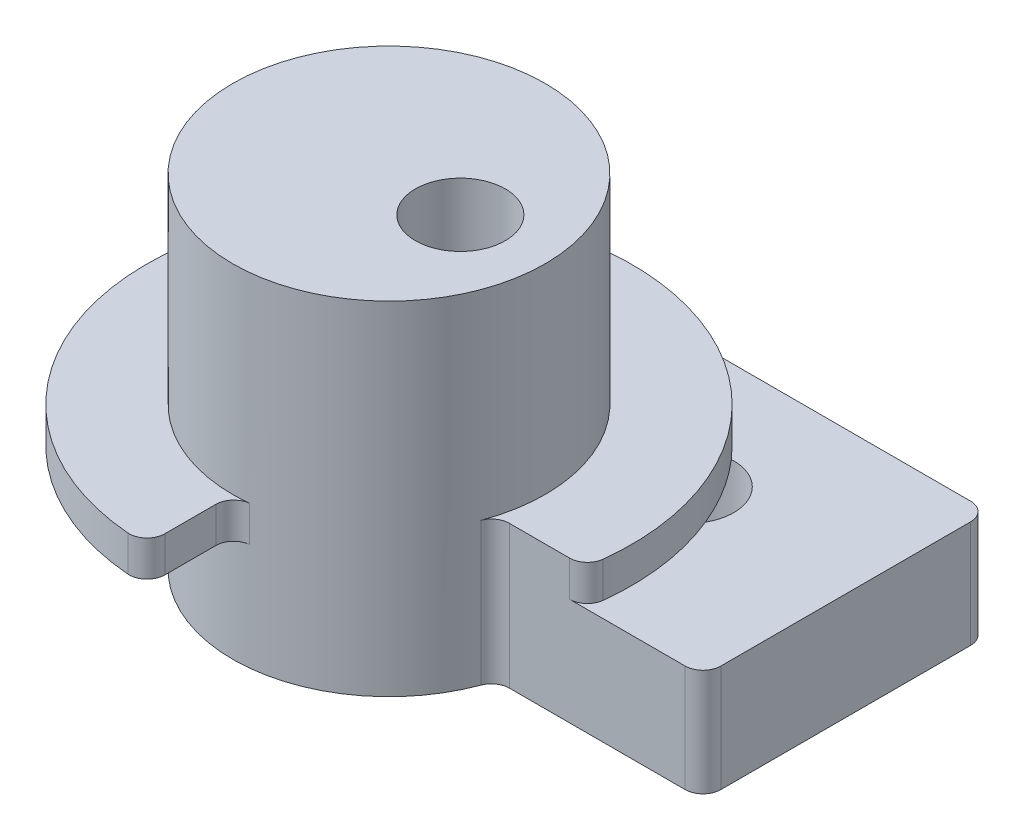
ISO-10303-21;
HEADER;
FILE_DESCRIPTION(('STEP AP214'),'2;1');
FILE_NAME('part.step','',(''),(''),'','','');
FILE_SCHEMA(('AUTOMOTIVE_DESIGN { 1 0 10303 214 1 1 1 1 }'));
ENDSEC;
DATA;
#1=APPLICATION_CONTEXT('core data for automotive mechanical design processes');
#2=APPLICATION_PROTOCOL_DEFINITION('international standard','automotive_design',2000,#1);
#3=PRODUCT_CONTEXT('',#1,'mechanical');
#4=PRODUCT('Part','Part','',(#3));
#5=PRODUCT_RELATED_PRODUCT_CATEGORY('part','',(#4));
#6=PRODUCT_DEFINITION_FORMATION('','',#4);
#7=PRODUCT_DEFINITION_CONTEXT('part definition',#1,'design');
#8=PRODUCT_DEFINITION('design','',#6,#7);
#9=PRODUCT_DEFINITION_SHAPE('','',#8);
#10=(LENGTH_UNIT() NAMED_UNIT(*) SI_UNIT(.MILLI.,.METRE.));
#11=(NAMED_UNIT(*) PLANE_ANGLE_UNIT() SI_UNIT($,.RADIAN.));
#12=(NAMED_UNIT(*) SI_UNIT($,.STERADIAN.) SOLID_ANGLE_UNIT());
#13=UNCERTAINTY_MEASURE_WITH_UNIT(LENGTH_MEASURE(1.E-05),#10,'distance_accuracy_value','');
#14=(GEOMETRIC_REPRESENTATION_CONTEXT(3) GLOBAL_UNCERTAINTY_ASSIGNED_CONTEXT((#13)) GLOBAL_UNIT_ASSIGNED_CONTEXT((#10,
#11,#12)) REPRESENTATION_CONTEXT('',''));
#15=CARTESIAN_POINT('',(0.,0.,0.));
#16=DIRECTION('',(0.,0.,1.));
#17=DIRECTION('',(1.,0.,0.));
#18=AXIS2_PLACEMENT_3D('',#15,#16,#17);
#19=CARTESIAN_POINT('',(0.,-10.4775,0.));
#20=DIRECTION('',(0.,-1.,0.));
#21=DIRECTION('',(-1.,0.,0.));
#22=AXIS2_PLACEMENT_3D('',#19,#20,#21);
#23=PLANE('',#22);
#24=CARTESIAN_POINT('',(0.,-10.4775,0.));
#25=DIRECTION('',(0.,-1.,0.));
#26=DIRECTION('',(1.,0.,0.));
#27=AXIS2_PLACEMENT_3D('',#24,#25,#26);
#28=CIRCLE('',#27,10.795);
#29=CARTESIAN_POINT('',(8.15130115952804,-10.4775,-7.07730982836534));
#30=VERTEX_POINT('',#29);
#31=CARTESIAN_POINT('',(9.99127496158985,-10.4775,-4.08735240001491));
#32=VERTEX_POINT('',#31);
#33=EDGE_CURVE('E239',#30,#32,#28,.T.);
#34=ORIENTED_EDGE('',*,*,#33,.T.);
#35=CARTESIAN_POINT('',(8.255,-10.4775,-5.08));
#36=DIRECTION('',(0.,1.,0.));
#37=DIRECTION('',(-1.,0.,0.));
#38=AXIS2_PLACEMENT_3D('',#35,#36,#37);
#39=CIRCLE('',#38,2.);
#40=EDGE_CURVE('E206',#32,#30,#39,.F.);
#41=ORIENTED_EDGE('',*,*,#40,.T.);
#42=EDGE_LOOP('',(#34,#41));
#43=FACE_BOUND('',#42,.T.);
#44=ADVANCED_FACE('F42',(#43),#23,.T.);
#45=CARTESIAN_POINT('',(0.,-15.24,0.));
#46=DIRECTION('',(0.,1.,0.));
#47=DIRECTION('',(1.,0.,0.));
#48=AXIS2_PLACEMENT_3D('',#45,#46,#47);
#49=PLANE('',#48);
#50=CARTESIAN_POINT('',(3.175,-15.24,0.));
#51=DIRECTION('',(0.,1.,0.));
#52=DIRECTION('',(-1.,0.,0.));
#53=AXIS2_PLACEMENT_3D('',#50,#51,#52);
#54=CIRCLE('',#53,2.);
#55=CARTESIAN_POINT('',(1.175,-15.24,0.));
#56=VERTEX_POINT('',#55);
#57=EDGE_CURVE('E209',#56,#56,#54,.T.);
#58=ORIENTED_EDGE('',*,*,#57,.T.);
#59=EDGE_LOOP('',(#58));
#60=FACE_BOUND('',#59,.T.);
#61=DIRECTION('',(1.,0.,0.));
#62=VECTOR('',#61,1.);
#63=CARTESIAN_POINT('',(0.,-15.24,-10.795));
#64=LINE('',#63,#62);
#65=CARTESIAN_POINT('',(0.793749999999998,-15.24,-10.795));
#66=VERTEX_POINT('',#65);
#67=CARTESIAN_POINT('',(15.08125,-15.24,-10.795));
#68=VERTEX_POINT('',#67);
#69=EDGE_CURVE('E215',#66,#68,#64,.T.);
#70=ORIENTED_EDGE('',*,*,#69,.T.);
#71=CARTESIAN_POINT('',(15.08125,-15.24,-10.00125));
#72=DIRECTION('',(0.,-1.,0.));
#73=DIRECTION('',(1.,0.,0.));
#74=AXIS2_PLACEMENT_3D('',#71,#72,#73);
#75=CIRCLE('',#74,0.79375);
#76=CARTESIAN_POINT('',(15.875,-15.24,-10.00125));
#77=VERTEX_POINT('',#76);
#78=EDGE_CURVE('E256',#77,#68,#75,.F.);
#79=ORIENTED_EDGE('',*,*,#78,.F.);
#80=DIRECTION('',(0.,0.,1.));
#81=VECTOR('',#80,1.);
#82=CARTESIAN_POINT('',(15.875,-15.24,0.));
#83=LINE('',#82,#81);
#84=CARTESIAN_POINT('',(15.875,-15.24,1.11125));
#85=VERTEX_POINT('',#84);
#86=EDGE_CURVE('E212',#77,#85,#83,.T.);
#87=ORIENTED_EDGE('',*,*,#86,.T.);
#88=CARTESIAN_POINT('',(15.08125,-15.24,1.11125));
#89=DIRECTION('',(0.,-1.,0.));
#90=DIRECTION('',(1.,0.,0.));
#91=AXIS2_PLACEMENT_3D('',#88,#89,#90);
#92=CIRCLE('',#91,0.79375);
#93=CARTESIAN_POINT('',(15.08125,-15.24,1.905));
#94=VERTEX_POINT('',#93);
#95=EDGE_CURVE('E253',#94,#85,#92,.F.);
#96=ORIENTED_EDGE('',*,*,#95,.F.);
#97=DIRECTION('',(1.,0.,0.));
#98=VECTOR('',#97,1.);
#99=CARTESIAN_POINT('',(0.,-15.24,1.905));
#100=LINE('',#99,#98);
#101=CARTESIAN_POINT('',(7.2582651164035,-15.24,1.905));
#102=VERTEX_POINT('',#101);
#103=EDGE_CURVE('E221',#102,#94,#100,.T.);
#104=ORIENTED_EDGE('',*,*,#103,.F.);
#105=CARTESIAN_POINT('',(7.2582651164035,-15.24,2.69875));
#106=DIRECTION('',(0.,-1.,0.));
#107=DIRECTION('',(1.,0.,0.));
#108=AXIS2_PLACEMENT_3D('',#105,#106,#107);
#109=CIRCLE('',#108,0.79375);
#110=CARTESIAN_POINT('',(6.5142782965623,-15.24,2.4221226795803));
#111=VERTEX_POINT('',#110);
#112=EDGE_CURVE('E169',#111,#102,#109,.T.);
#113=ORIENTED_EDGE('',*,*,#112,.F.);
#114=CARTESIAN_POINT('',(0.,-15.24,0.));
#115=DIRECTION('',(0.,-1.,0.));
#116=DIRECTION('',(1.,0.,0.));
#117=AXIS2_PLACEMENT_3D('',#114,#115,#116);
#118=CIRCLE('',#117,6.95);
#119=CARTESIAN_POINT('',(-0.712389023405975,-15.24,-6.91339293540666));
#120=VERTEX_POINT('',#119);
#121=EDGE_CURVE('E241',#111,#120,#118,.T.);
#122=ORIENTED_EDGE('',*,*,#121,.T.);
#123=CARTESIAN_POINT('',(-0.793750000000003,-15.24,-7.70296209259788));
#124=DIRECTION('',(0.,-1.,0.));
#125=DIRECTION('',(1.,0.,0.));
#126=AXIS2_PLACEMENT_3D('',#123,#124,#125);
#127=CIRCLE('',#126,0.79375);
#128=CARTESIAN_POINT('',(0.,-15.24,-7.70296209259788));
#129=VERTEX_POINT('',#128);
#130=EDGE_CURVE('E287',#129,#120,#127,.T.);
#131=ORIENTED_EDGE('',*,*,#130,.F.);
#132=DIRECTION('',(0.,0.,1.));
#133=VECTOR('',#132,1.);
#134=CARTESIAN_POINT('',(0.,-15.24,0.));
#135=LINE('',#134,#133);
#136=CARTESIAN_POINT('',(0.,-15.24,-10.00125));
#137=VERTEX_POINT('',#136);
#138=EDGE_CURVE('E218',#137,#129,#135,.T.);
#139=ORIENTED_EDGE('',*,*,#138,.F.);
#140=CARTESIAN_POINT('',(0.793749999999998,-15.24,-10.00125));
#141=DIRECTION('',(0.,-1.,0.));
#142=DIRECTION('',(1.,0.,0.));
#143=AXIS2_PLACEMENT_3D('',#140,#141,#142);
#144=CIRCLE('',#143,0.79375);
#145=EDGE_CURVE('E259',#66,#137,#144,.F.);
#146=ORIENTED_EDGE('',*,*,#145,.F.);
#147=EDGE_LOOP('',(#70,#79,#87,#96,#104,#113,#122,#131,#139,#146));
#148=FACE_BOUND('',#147,.T.);
#149=CARTESIAN_POINT('',(8.255,-15.24,-5.08));
#150=DIRECTION('',(0.,1.,0.));
#151=DIRECTION('',(-1.,0.,0.));
#152=AXIS2_PLACEMENT_3D('',#149,#150,#151);
#153=CIRCLE('',#152,2.);
#154=CARTESIAN_POINT('',(6.255,-15.24,-5.08));
#155=VERTEX_POINT('',#154);
#156=EDGE_CURVE('E193',#155,#155,#153,.T.);
#157=ORIENTED_EDGE('',*,*,#156,.T.);
#158=EDGE_LOOP('',(#157));
#159=FACE_BOUND('',#158,.T.);
#160=ADVANCED_FACE('F327',(#60,#148,#159),#49,.F.);
#161=CARTESIAN_POINT('',(-0.856746031746001,-10.4775,10.7609484357601));
#162=VERTEX_POINT('',#161);
#163=CARTESIAN_POINT('',(0.625135553208775,-10.4775,-10.7768840830787));
#164=VERTEX_POINT('',#163);
#165=EDGE_CURVE('E234',#162,#164,#28,.T.);
#166=ORIENTED_EDGE('',*,*,#165,.T.);
#167=CARTESIAN_POINT('',(0.793749999999999,-10.4775,-10.00125));
#168=DIRECTION('',(0.,1.,0.));
#169=DIRECTION('',(-1.,0.,0.));
#170=AXIS2_PLACEMENT_3D('',#167,#168,#169);
#171=CIRCLE('',#170,0.79375);
#172=CARTESIAN_POINT('',(0.,-10.4775,-10.00125));
#173=VERTEX_POINT('',#172);
#174=EDGE_CURVE('E173',#173,#164,#171,.F.);
#175=ORIENTED_EDGE('',*,*,#174,.F.);
#176=DIRECTION('',(0.,0.,-1.));
#177=VECTOR('',#176,1.);
#178=CARTESIAN_POINT('',(0.,-10.4775,0.));
#179=LINE('',#178,#177);
#180=CARTESIAN_POINT('',(0.,-10.4775,-7.70296209259788));
#181=VERTEX_POINT('',#180);
#182=EDGE_CURVE('E197',#181,#173,#179,.T.);
#183=ORIENTED_EDGE('',*,*,#182,.F.);
#184=CARTESIAN_POINT('',(-0.793750000000002,-10.4775,-7.70296209259788));
#185=DIRECTION('',(0.,1.,0.));
#186=DIRECTION('',(-1.,0.,0.));
#187=AXIS2_PLACEMENT_3D('',#184,#185,#186);
#188=CIRCLE('',#187,0.79375);
#189=CARTESIAN_POINT('',(-0.712389023405975,-10.4775,-6.91339293540666));
#190=VERTEX_POINT('',#189);
#191=EDGE_CURVE('E276',#190,#181,#188,.T.);
#192=ORIENTED_EDGE('',*,*,#191,.F.);
#193=CARTESIAN_POINT('',(0.,-10.4775,0.));
#194=DIRECTION('',(0.,-1.,0.));
#195=DIRECTION('',(1.,0.,0.));
#196=AXIS2_PLACEMENT_3D('',#193,#194,#195);
#197=CIRCLE('',#196,6.95);
#198=CARTESIAN_POINT('',(0.712389023405977,-10.4775,6.91339293540666));
#199=VERTEX_POINT('',#198);
#200=EDGE_CURVE('E237',#199,#190,#197,.T.);
#201=ORIENTED_EDGE('',*,*,#200,.F.);
#202=CARTESIAN_POINT('',(0.793750000000006,-10.4775,7.70296209259788));
#203=DIRECTION('',(0.,1.,0.));
#204=DIRECTION('',(-1.,0.,0.));
#205=AXIS2_PLACEMENT_3D('',#202,#203,#204);
#206=CIRCLE('',#205,0.79375);
#207=CARTESIAN_POINT('',(0.,-10.4775,7.70296209259789));
#208=VERTEX_POINT('',#207);
#209=EDGE_CURVE('E50',#208,#199,#206,.F.);
#210=ORIENTED_EDGE('',*,*,#209,.F.);
#211=DIRECTION('',(0.,0.,1.));
#212=VECTOR('',#211,1.);
#213=CARTESIAN_POINT('',(0.,-10.4775,0.));
#214=LINE('',#213,#212);
#215=CARTESIAN_POINT('',(0.,-10.4775,9.96970222724831));
#216=VERTEX_POINT('',#215);
#217=EDGE_CURVE('E184',#208,#216,#214,.T.);
#218=ORIENTED_EDGE('',*,*,#217,.T.);
#219=CARTESIAN_POINT('',(-0.793749999999972,-10.4775,9.96970222724831));
#220=DIRECTION('',(0.,1.,0.));
#221=DIRECTION('',(-1.,0.,0.));
#222=AXIS2_PLACEMENT_3D('',#219,#220,#221);
#223=CIRCLE('',#222,0.79375);
#224=EDGE_CURVE('E306',#162,#216,#223,.T.);
#225=ORIENTED_EDGE('',*,*,#224,.F.);
#226=EDGE_LOOP('',(#166,#175,#183,#192,#201,#210,#218,#225));
#227=FACE_BOUND('',#226,.T.);
#228=ADVANCED_FACE('F317',(#227),#23,.T.);
#229=CARTESIAN_POINT('',(0.,15.24,0.));
#230=DIRECTION('',(0.,1.,0.));
#231=DIRECTION('',(1.,0.,0.));
#232=AXIS2_PLACEMENT_3D('',#229,#230,#231);
#233=CYLINDRICAL_SURFACE('',#232,10.795);
#234=CARTESIAN_POINT('',(10.728157252049,-10.4775,1.19944444444444));
#235=VERTEX_POINT('',#234);
#236=EDGE_CURVE('E233',#32,#235,#28,.T.);
#237=ORIENTED_EDGE('',*,*,#236,.F.);
#238=ORIENTED_EDGE('',*,*,#33,.F.);
#239=EDGE_CURVE('E238',#164,#30,#28,.T.);
#240=ORIENTED_EDGE('',*,*,#239,.F.);
#241=ORIENTED_EDGE('',*,*,#165,.F.);
#242=DIRECTION('',(0.,1.,0.));
#243=VECTOR('',#242,1.);
#244=CARTESIAN_POINT('',(-0.856746031745998,15.24,10.7609484357601));
#245=LINE('',#244,#243);
#246=CARTESIAN_POINT('',(-0.856746031746001,-8.89,10.7609484357601));
#247=VERTEX_POINT('',#246);
#248=EDGE_CURVE('E292',#247,#162,#245,.F.);
#249=ORIENTED_EDGE('',*,*,#248,.F.);
#250=CARTESIAN_POINT('',(0.,-8.89,0.));
#251=DIRECTION('',(0.,-1.,0.));
#252=DIRECTION('',(1.,0.,0.));
#253=AXIS2_PLACEMENT_3D('',#250,#251,#252);
#254=CIRCLE('',#253,10.795);
#255=CARTESIAN_POINT('',(10.728157252049,-8.89,1.19944444444444));
#256=VERTEX_POINT('',#255);
#257=EDGE_CURVE('E229',#247,#256,#254,.T.);
#258=ORIENTED_EDGE('',*,*,#257,.T.);
#259=DIRECTION('',(0.,1.,0.));
#260=VECTOR('',#259,1.);
#261=CARTESIAN_POINT('',(10.728157252049,15.24,1.19944444444444));
#262=LINE('',#261,#260);
#263=EDGE_CURVE('E294',#235,#256,#262,.T.);
#264=ORIENTED_EDGE('',*,*,#263,.F.);
#265=EDGE_LOOP('',(#237,#238,#240,#241,#249,#258,#264));
#266=FACE_BOUND('',#265,.T.);
#267=ADVANCED_FACE('F348',(#266),#233,.T.);
#268=CARTESIAN_POINT('',(0.,-8.89,0.));
#269=DIRECTION('',(0.,-1.,0.));
#270=DIRECTION('',(-1.,0.,0.));
#271=AXIS2_PLACEMENT_3D('',#268,#269,#270);
#272=PLANE('',#271);
#273=ORIENTED_EDGE('',*,*,#257,.F.);
#274=CARTESIAN_POINT('',(-0.793749999999972,-8.89,9.96970222724831));
#275=DIRECTION('',(0.,1.,0.));
#276=DIRECTION('',(-1.,0.,0.));
#277=AXIS2_PLACEMENT_3D('',#274,#275,#276);
#278=CIRCLE('',#277,0.79375);
#279=CARTESIAN_POINT('',(0.,-8.89,9.96970222724831));
#280=VERTEX_POINT('',#279);
#281=EDGE_CURVE('E297',#280,#247,#278,.F.);
#282=ORIENTED_EDGE('',*,*,#281,.F.);
#283=DIRECTION('',(0.,0.,1.));
#284=VECTOR('',#283,1.);
#285=CARTESIAN_POINT('',(0.,-8.89,0.));
#286=LINE('',#285,#284);
#287=CARTESIAN_POINT('',(0.,-8.89,7.70296209259789));
#288=VERTEX_POINT('',#287);
#289=EDGE_CURVE('E190',#288,#280,#286,.T.);
#290=ORIENTED_EDGE('',*,*,#289,.F.);
#291=CARTESIAN_POINT('',(0.793750000000006,-8.89,7.70296209259788));
#292=DIRECTION('',(0.,1.,0.));
#293=DIRECTION('',(-1.,0.,0.));
#294=AXIS2_PLACEMENT_3D('',#291,#292,#293);
#295=CIRCLE('',#294,0.79375);
#296=CARTESIAN_POINT('',(0.712389023405977,-8.89,6.91339293540666));
#297=VERTEX_POINT('',#296);
#298=EDGE_CURVE('E11',#297,#288,#295,.T.);
#299=ORIENTED_EDGE('',*,*,#298,.F.);
#300=CARTESIAN_POINT('',(0.,-8.89,0.));
#301=DIRECTION('',(0.,-1.,0.));
#302=DIRECTION('',(1.,0.,0.));
#303=AXIS2_PLACEMENT_3D('',#300,#301,#302);
#304=CIRCLE('',#303,6.95);
#305=CARTESIAN_POINT('',(6.5142782965623,-8.89,2.4221226795803));
#306=VERTEX_POINT('',#305);
#307=EDGE_CURVE('E189',#297,#306,#304,.T.);
#308=ORIENTED_EDGE('',*,*,#307,.T.);
#309=CARTESIAN_POINT('',(7.2582651164035,-8.89000000000001,2.69875));
#310=DIRECTION('',(0.,1.,0.));
#311=DIRECTION('',(-1.,0.,0.));
#312=AXIS2_PLACEMENT_3D('',#309,#310,#311);
#313=CIRCLE('',#312,0.79375);
#314=CARTESIAN_POINT('',(7.2582651164035,-8.89000000000001,1.905));
#315=VERTEX_POINT('',#314);
#316=EDGE_CURVE('E166',#315,#306,#313,.T.);
#317=ORIENTED_EDGE('',*,*,#316,.F.);
#318=DIRECTION('',(-1.,0.,0.));
#319=VECTOR('',#318,1.);
#320=CARTESIAN_POINT('',(0.,-8.89,1.905));
#321=LINE('',#320,#319);
#322=CARTESIAN_POINT('',(9.93932215998656,-8.89000000000001,1.905));
#323=VERTEX_POINT('',#322);
#324=EDGE_CURVE('E177',#323,#315,#321,.T.);
#325=ORIENTED_EDGE('',*,*,#324,.F.);
#326=CARTESIAN_POINT('',(9.93932215998656,-8.89,1.11125));
#327=DIRECTION('',(0.,1.,0.));
#328=DIRECTION('',(-1.,0.,0.));
#329=AXIS2_PLACEMENT_3D('',#326,#327,#328);
#330=CIRCLE('',#329,0.79375);
#331=EDGE_CURVE('E299',#256,#323,#330,.F.);
#332=ORIENTED_EDGE('',*,*,#331,.F.);
#333=EDGE_LOOP('',(#273,#282,#290,#299,#308,#317,#325,#332));
#334=FACE_BOUND('',#333,.T.);
#335=ADVANCED_FACE('F187',(#334),#272,.F.);
#336=CARTESIAN_POINT('',(0.,15.24,0.));
#337=DIRECTION('',(0.,1.,0.));
#338=DIRECTION('',(1.,0.,0.));
#339=AXIS2_PLACEMENT_3D('',#336,#337,#338);
#340=CYLINDRICAL_SURFACE('',#339,6.95);
#341=ORIENTED_EDGE('',*,*,#200,.T.);
#342=DIRECTION('',(0.,1.,0.));
#343=VECTOR('',#342,1.);
#344=CARTESIAN_POINT('',(-0.712389023405972,15.24,-6.91339293540666));
#345=LINE('',#344,#343);
#346=EDGE_CURVE('E274',#120,#190,#345,.T.);
#347=ORIENTED_EDGE('',*,*,#346,.F.);
#348=ORIENTED_EDGE('',*,*,#121,.F.);
#349=DIRECTION('',(0.,1.,0.));
#350=VECTOR('',#349,1.);
#351=CARTESIAN_POINT('',(6.51427829656231,15.24,2.4221226795803));
#352=LINE('',#351,#350);
#353=EDGE_CURVE('E272',#306,#111,#352,.F.);
#354=ORIENTED_EDGE('',*,*,#353,.F.);
#355=ORIENTED_EDGE('',*,*,#307,.F.);
#356=DIRECTION('',(0.,1.,0.));
#357=VECTOR('',#356,1.);
#358=CARTESIAN_POINT('',(0.71238902340598,15.24,6.91339293540666));
#359=LINE('',#358,#357);
#360=EDGE_CURVE('E57',#199,#297,#359,.T.);
#361=ORIENTED_EDGE('',*,*,#360,.F.);
#362=EDGE_LOOP('',(#341,#347,#348,#354,#355,#361));
#363=FACE_BOUND('',#362,.T.);
#364=CARTESIAN_POINT('',(0.,0.,0.));
#365=DIRECTION('',(0.,1.,0.));
#366=DIRECTION('',(0.,0.,1.));
#367=AXIS2_PLACEMENT_3D('',#364,#365,#366);
#368=CIRCLE('',#367,6.95);
#369=CARTESIAN_POINT('',(0.,0.,6.95));
#370=VERTEX_POINT('',#369);
#371=EDGE_CURVE('E230',#370,#370,#368,.T.);
#372=ORIENTED_EDGE('',*,*,#371,.F.);
#373=EDGE_LOOP('',(#372));
#374=FACE_BOUND('',#373,.T.);
#375=ADVANCED_FACE('F319',(#363,#374),#340,.T.);
#376=CARTESIAN_POINT('',(0.,0.,0.));
#377=DIRECTION('',(0.,-1.,0.));
#378=DIRECTION('',(0.,0.,1.));
#379=AXIS2_PLACEMENT_3D('',#376,#377,#378);
#380=PLANE('',#379);
#381=CARTESIAN_POINT('',(3.175,0.,0.));
#382=DIRECTION('',(0.,1.,0.));
#383=DIRECTION('',(0.,0.,1.));
#384=AXIS2_PLACEMENT_3D('',#381,#382,#383);
#385=CIRCLE('',#384,2.);
#386=CARTESIAN_POINT('',(3.175,0.,2.));
#387=VERTEX_POINT('',#386);
#388=EDGE_CURVE('E227',#387,#387,#385,.T.);
#389=ORIENTED_EDGE('',*,*,#388,.F.);
#390=EDGE_LOOP('',(#389));
#391=FACE_BOUND('',#390,.T.);
#392=ORIENTED_EDGE('',*,*,#371,.T.);
#393=EDGE_LOOP('',(#392));
#394=FACE_BOUND('',#393,.T.);
#395=ADVANCED_FACE('F385',(#391,#394),#380,.F.);
#396=CARTESIAN_POINT('',(3.175,12.192,0.));
#397=DIRECTION('',(0.,-1.,0.));
#398=DIRECTION('',(-1.,0.,0.));
#399=AXIS2_PLACEMENT_3D('',#396,#397,#398);
#400=CYLINDRICAL_SURFACE('',#399,2.);
#401=ORIENTED_EDGE('',*,*,#57,.F.);
#402=EDGE_LOOP('',(#401));
#403=FACE_BOUND('',#402,.T.);
#404=ORIENTED_EDGE('',*,*,#388,.T.);
#405=EDGE_LOOP('',(#404));
#406=FACE_BOUND('',#405,.T.);
#407=ADVANCED_FACE('F388',(#403,#406),#400,.F.);
#408=CARTESIAN_POINT('',(8.255,9.85241945384929,-5.08));
#409=DIRECTION('',(0.,-1.,0.));
#410=DIRECTION('',(-1.,0.,0.));
#411=AXIS2_PLACEMENT_3D('',#408,#409,#410);
#412=CYLINDRICAL_SURFACE('',#411,2.);
#413=EDGE_CURVE('E207',#30,#32,#39,.F.);
#414=ORIENTED_EDGE('',*,*,#413,.F.);
#415=ORIENTED_EDGE('',*,*,#40,.F.);
#416=EDGE_LOOP('',(#414,#415));
#417=FACE_BOUND('',#416,.T.);
#418=ORIENTED_EDGE('',*,*,#156,.F.);
#419=EDGE_LOOP('',(#418));
#420=FACE_BOUND('',#419,.T.);
#421=ADVANCED_FACE('F392',(#417,#420),#412,.F.);
#422=CARTESIAN_POINT('',(0.,9.85241945384929,-10.795));
#423=DIRECTION('',(0.,0.,1.));
#424=DIRECTION('',(1.,0.,0.));
#425=AXIS2_PLACEMENT_3D('',#422,#423,#424);
#426=PLANE('',#425);
#427=DIRECTION('',(-1.,0.,0.));
#428=VECTOR('',#427,1.);
#429=CARTESIAN_POINT('',(0.,-10.4775,-10.795));
#430=LINE('',#429,#428);
#431=CARTESIAN_POINT('',(15.08125,-10.4775,-10.795));
#432=VERTEX_POINT('',#431);
#433=CARTESIAN_POINT('',(0.793749999999998,-10.4775,-10.795));
#434=VERTEX_POINT('',#433);
#435=EDGE_CURVE('E201',#432,#434,#430,.T.);
#436=ORIENTED_EDGE('',*,*,#435,.F.);
#437=DIRECTION('',(0.,-1.,0.));
#438=VECTOR('',#437,1.);
#439=CARTESIAN_POINT('',(15.08125,9.85241945384929,-10.795));
#440=LINE('',#439,#438);
#441=EDGE_CURVE('E244',#68,#432,#440,.F.);
#442=ORIENTED_EDGE('',*,*,#441,.F.);
#443=ORIENTED_EDGE('',*,*,#69,.F.);
#444=DIRECTION('',(0.,-1.,0.));
#445=VECTOR('',#444,1.);
#446=CARTESIAN_POINT('',(0.793749999999998,-15.24,-10.795));
#447=LINE('',#446,#445);
#448=EDGE_CURVE('E251',#434,#66,#447,.T.);
#449=ORIENTED_EDGE('',*,*,#448,.F.);
#450=EDGE_LOOP('',(#436,#442,#443,#449));
#451=FACE_BOUND('',#450,.T.);
#452=ADVANCED_FACE('F396',(#451),#426,.F.);
#453=CARTESIAN_POINT('',(0.,9.85241945384929,0.));
#454=DIRECTION('',(-1.,0.,0.));
#455=DIRECTION('',(0.,1.,0.));
#456=AXIS2_PLACEMENT_3D('',#453,#454,#455);
#457=PLANE('',#456);
#458=ORIENTED_EDGE('',*,*,#138,.T.);
#459=DIRECTION('',(0.,1.,0.));
#460=VECTOR('',#459,1.);
#461=CARTESIAN_POINT('',(0.,9.85241945384929,-7.70296209259788));
#462=LINE('',#461,#460);
#463=EDGE_CURVE('E262',#181,#129,#462,.F.);
#464=ORIENTED_EDGE('',*,*,#463,.F.);
#465=ORIENTED_EDGE('',*,*,#182,.T.);
#466=DIRECTION('',(0.,-1.,0.));
#467=VECTOR('',#466,1.);
#468=CARTESIAN_POINT('',(0.,-10.4775,-10.00125));
#469=LINE('',#468,#467);
#470=EDGE_CURVE('E264',#137,#173,#469,.F.);
#471=ORIENTED_EDGE('',*,*,#470,.F.);
#472=EDGE_LOOP('',(#458,#464,#465,#471));
#473=FACE_BOUND('',#472,.T.);
#474=ADVANCED_FACE('F404',(#473),#457,.T.);
#475=CARTESIAN_POINT('',(0.,9.85241945384929,1.905));
#476=DIRECTION('',(0.,0.,1.));
#477=DIRECTION('',(1.,0.,0.));
#478=AXIS2_PLACEMENT_3D('',#475,#476,#477);
#479=PLANE('',#478);
#480=ORIENTED_EDGE('',*,*,#324,.T.);
#481=DIRECTION('',(0.,1.,0.));
#482=VECTOR('',#481,1.);
#483=CARTESIAN_POINT('',(7.2582651164035,9.85241945384929,1.905));
#484=LINE('',#483,#482);
#485=EDGE_CURVE('E162',#102,#315,#484,.T.);
#486=ORIENTED_EDGE('',*,*,#485,.F.);
#487=ORIENTED_EDGE('',*,*,#103,.T.);
#488=DIRECTION('',(0.,-1.,0.));
#489=VECTOR('',#488,1.);
#490=CARTESIAN_POINT('',(15.08125,-15.24,1.905));
#491=LINE('',#490,#489);
#492=CARTESIAN_POINT('',(15.08125,-10.4775,1.905));
#493=VERTEX_POINT('',#492);
#494=EDGE_CURVE('E174',#493,#94,#491,.T.);
#495=ORIENTED_EDGE('',*,*,#494,.F.);
#496=DIRECTION('',(-1.,0.,0.));
#497=VECTOR('',#496,1.);
#498=CARTESIAN_POINT('',(0.,-10.4775,1.905));
#499=LINE('',#498,#497);
#500=CARTESIAN_POINT('',(9.93932215998656,-10.4775,1.905));
#501=VERTEX_POINT('',#500);
#502=EDGE_CURVE('E200',#493,#501,#499,.T.);
#503=ORIENTED_EDGE('',*,*,#502,.T.);
#504=DIRECTION('',(0.,-1.,0.));
#505=VECTOR('',#504,1.);
#506=CARTESIAN_POINT('',(9.93932215998656,-10.4775,1.905));
#507=LINE('',#506,#505);
#508=EDGE_CURVE('E181',#323,#501,#507,.T.);
#509=ORIENTED_EDGE('',*,*,#508,.F.);
#510=EDGE_LOOP('',(#480,#486,#487,#495,#503,#509));
#511=FACE_BOUND('',#510,.T.);
#512=ADVANCED_FACE('F178',(#511),#479,.T.);
#513=CARTESIAN_POINT('',(15.875,9.85241945384929,0.));
#514=DIRECTION('',(-1.,0.,0.));
#515=DIRECTION('',(0.,1.,0.));
#516=AXIS2_PLACEMENT_3D('',#513,#514,#515);
#517=PLANE('',#516);
#518=DIRECTION('',(0.,0.,-1.));
#519=VECTOR('',#518,1.);
#520=CARTESIAN_POINT('',(15.875,-10.4775,0.));
#521=LINE('',#520,#519);
#522=CARTESIAN_POINT('',(15.875,-10.4775,1.11125));
#523=VERTEX_POINT('',#522);
#524=CARTESIAN_POINT('',(15.875,-10.4775,-10.00125));
#525=VERTEX_POINT('',#524);
#526=EDGE_CURVE('E203',#523,#525,#521,.T.);
#527=ORIENTED_EDGE('',*,*,#526,.F.);
#528=DIRECTION('',(0.,-1.,0.));
#529=VECTOR('',#528,1.);
#530=CARTESIAN_POINT('',(15.875,-10.4775,1.11125));
#531=LINE('',#530,#529);
#532=EDGE_CURVE('E279',#85,#523,#531,.F.);
#533=ORIENTED_EDGE('',*,*,#532,.F.);
#534=ORIENTED_EDGE('',*,*,#86,.F.);
#535=DIRECTION('',(0.,-1.,0.));
#536=VECTOR('',#535,1.);
#537=CARTESIAN_POINT('',(15.875,9.85241945384929,-10.00125));
#538=LINE('',#537,#536);
#539=EDGE_CURVE('E282',#525,#77,#538,.T.);
#540=ORIENTED_EDGE('',*,*,#539,.F.);
#541=EDGE_LOOP('',(#527,#533,#534,#540));
#542=FACE_BOUND('',#541,.T.);
#543=ADVANCED_FACE('F398',(#542),#517,.F.);
#544=CARTESIAN_POINT('',(0.,-10.4775,0.));
#545=DIRECTION('',(0.,-1.,0.));
#546=DIRECTION('',(-1.,0.,0.));
#547=AXIS2_PLACEMENT_3D('',#544,#545,#546);
#548=PLANE('',#547);
#549=ORIENTED_EDGE('',*,*,#239,.T.);
#550=ORIENTED_EDGE('',*,*,#413,.T.);
#551=ORIENTED_EDGE('',*,*,#236,.T.);
#552=CARTESIAN_POINT('',(9.93932215998656,-10.4775,1.11125));
#553=DIRECTION('',(0.,1.,0.));
#554=DIRECTION('',(-1.,0.,0.));
#555=AXIS2_PLACEMENT_3D('',#552,#553,#554);
#556=CIRCLE('',#555,0.79375);
#557=EDGE_CURVE('E309',#501,#235,#556,.T.);
#558=ORIENTED_EDGE('',*,*,#557,.F.);
#559=ORIENTED_EDGE('',*,*,#502,.F.);
#560=CARTESIAN_POINT('',(15.08125,-10.4775,1.11125));
#561=DIRECTION('',(0.,1.,0.));
#562=DIRECTION('',(-1.,0.,0.));
#563=AXIS2_PLACEMENT_3D('',#560,#561,#562);
#564=CIRCLE('',#563,0.79375);
#565=EDGE_CURVE('E266',#523,#493,#564,.F.);
#566=ORIENTED_EDGE('',*,*,#565,.F.);
#567=ORIENTED_EDGE('',*,*,#526,.T.);
#568=CARTESIAN_POINT('',(15.08125,-10.4775,-10.00125));
#569=DIRECTION('',(0.,1.,0.));
#570=DIRECTION('',(-1.,0.,0.));
#571=AXIS2_PLACEMENT_3D('',#568,#569,#570);
#572=CIRCLE('',#571,0.79375);
#573=EDGE_CURVE('E268',#432,#525,#572,.F.);
#574=ORIENTED_EDGE('',*,*,#573,.F.);
#575=ORIENTED_EDGE('',*,*,#435,.T.);
#576=CARTESIAN_POINT('',(0.793749999999999,-10.4775,-10.00125));
#577=DIRECTION('',(0.,1.,0.));
#578=DIRECTION('',(-1.,0.,0.));
#579=AXIS2_PLACEMENT_3D('',#576,#577,#578);
#580=CIRCLE('',#579,0.79375);
#581=EDGE_CURVE('E270',#164,#434,#580,.F.);
#582=ORIENTED_EDGE('',*,*,#581,.F.);
#583=EDGE_LOOP('',(#549,#550,#551,#558,#559,#566,#567,#574,#575,#582));
#584=FACE_BOUND('',#583,.T.);
#585=ADVANCED_FACE('F337',(#584),#548,.F.);
#586=CARTESIAN_POINT('',(0.793750000000001,9.85241945384929,-10.00125));
#587=DIRECTION('',(0.,1.,0.));
#588=DIRECTION('',(1.,0.,0.));
#589=AXIS2_PLACEMENT_3D('',#586,#587,#588);
#590=CYLINDRICAL_SURFACE('',#589,0.79375);
#591=ORIENTED_EDGE('',*,*,#174,.T.);
#592=ORIENTED_EDGE('',*,*,#581,.T.);
#593=ORIENTED_EDGE('',*,*,#448,.T.);
#594=ORIENTED_EDGE('',*,*,#145,.T.);
#595=ORIENTED_EDGE('',*,*,#470,.T.);
#596=EDGE_LOOP('',(#591,#592,#593,#594,#595));
#597=FACE_BOUND('',#596,.T.);
#598=ADVANCED_FACE('F411',(#597),#590,.T.);
#599=CARTESIAN_POINT('',(-0.793749999999999,15.24,-7.70296209259788));
#600=DIRECTION('',(0.,1.,0.));
#601=DIRECTION('',(1.,0.,0.));
#602=AXIS2_PLACEMENT_3D('',#599,#600,#601);
#603=CYLINDRICAL_SURFACE('',#602,0.79375);
#604=ORIENTED_EDGE('',*,*,#191,.T.);
#605=ORIENTED_EDGE('',*,*,#463,.T.);
#606=ORIENTED_EDGE('',*,*,#130,.T.);
#607=ORIENTED_EDGE('',*,*,#346,.T.);
#608=EDGE_LOOP('',(#604,#605,#606,#607));
#609=FACE_BOUND('',#608,.T.);
#610=ADVANCED_FACE('F324',(#609),#603,.F.);
#611=CARTESIAN_POINT('',(15.08125,9.85241945384929,-10.00125));
#612=DIRECTION('',(0.,-1.,0.));
#613=DIRECTION('',(-1.,0.,0.));
#614=AXIS2_PLACEMENT_3D('',#611,#612,#613);
#615=CYLINDRICAL_SURFACE('',#614,0.79375);
#616=ORIENTED_EDGE('',*,*,#573,.T.);
#617=ORIENTED_EDGE('',*,*,#539,.T.);
#618=ORIENTED_EDGE('',*,*,#78,.T.);
#619=ORIENTED_EDGE('',*,*,#441,.T.);
#620=EDGE_LOOP('',(#616,#617,#618,#619));
#621=FACE_BOUND('',#620,.T.);
#622=ADVANCED_FACE('F420',(#621),#615,.T.);
#623=CARTESIAN_POINT('',(7.2582651164035,15.24,2.69875));
#624=DIRECTION('',(0.,1.,0.));
#625=DIRECTION('',(1.,0.,0.));
#626=AXIS2_PLACEMENT_3D('',#623,#624,#625);
#627=CYLINDRICAL_SURFACE('',#626,0.79375);
#628=ORIENTED_EDGE('',*,*,#353,.T.);
#629=ORIENTED_EDGE('',*,*,#112,.T.);
#630=ORIENTED_EDGE('',*,*,#485,.T.);
#631=ORIENTED_EDGE('',*,*,#316,.T.);
#632=EDGE_LOOP('',(#628,#629,#630,#631));
#633=FACE_BOUND('',#632,.T.);
#634=ADVANCED_FACE('F164',(#633),#627,.F.);
#635=CARTESIAN_POINT('',(15.08125,9.85241945384929,1.11125));
#636=DIRECTION('',(0.,1.,0.));
#637=DIRECTION('',(1.,0.,0.));
#638=AXIS2_PLACEMENT_3D('',#635,#636,#637);
#639=CYLINDRICAL_SURFACE('',#638,0.79375);
#640=ORIENTED_EDGE('',*,*,#565,.T.);
#641=ORIENTED_EDGE('',*,*,#494,.T.);
#642=ORIENTED_EDGE('',*,*,#95,.T.);
#643=ORIENTED_EDGE('',*,*,#532,.T.);
#644=EDGE_LOOP('',(#640,#641,#642,#643));
#645=FACE_BOUND('',#644,.T.);
#646=ADVANCED_FACE('F333',(#645),#639,.T.);
#647=CARTESIAN_POINT('',(0.,3.7465,0.));
#648=DIRECTION('',(-1.,0.,0.));
#649=DIRECTION('',(0.,0.,1.));
#650=AXIS2_PLACEMENT_3D('',#647,#648,#649);
#651=PLANE('',#650);
#652=ORIENTED_EDGE('',*,*,#289,.T.);
#653=DIRECTION('',(0.,1.,0.));
#654=VECTOR('',#653,1.);
#655=CARTESIAN_POINT('',(0.,3.7465,9.96970222724831));
#656=LINE('',#655,#654);
#657=EDGE_CURVE('E301',#216,#280,#656,.T.);
#658=ORIENTED_EDGE('',*,*,#657,.F.);
#659=ORIENTED_EDGE('',*,*,#217,.F.);
#660=DIRECTION('',(0.,-1.,0.));
#661=VECTOR('',#660,1.);
#662=CARTESIAN_POINT('',(0.,-10.4775,7.70296209259789));
#663=LINE('',#662,#661);
#664=EDGE_CURVE('E303',#288,#208,#663,.T.);
#665=ORIENTED_EDGE('',*,*,#664,.F.);
#666=EDGE_LOOP('',(#652,#658,#659,#665));
#667=FACE_BOUND('',#666,.T.);
#668=ADVANCED_FACE('F354',(#667),#651,.F.);
#669=CARTESIAN_POINT('',(9.93932215998656,15.24,1.11125));
#670=DIRECTION('',(0.,1.,0.));
#671=DIRECTION('',(1.,0.,0.));
#672=AXIS2_PLACEMENT_3D('',#669,#670,#671);
#673=CYLINDRICAL_SURFACE('',#672,0.79375);
#674=ORIENTED_EDGE('',*,*,#331,.T.);
#675=ORIENTED_EDGE('',*,*,#508,.T.);
#676=ORIENTED_EDGE('',*,*,#557,.T.);
#677=ORIENTED_EDGE('',*,*,#263,.T.);
#678=EDGE_LOOP('',(#674,#675,#676,#677));
#679=FACE_BOUND('',#678,.T.);
#680=ADVANCED_FACE('F342',(#679),#673,.T.);
#681=CARTESIAN_POINT('',(0.793750000000009,15.24,7.70296209259788));
#682=DIRECTION('',(0.,1.,0.));
#683=DIRECTION('',(1.,0.,0.));
#684=AXIS2_PLACEMENT_3D('',#681,#682,#683);
#685=CYLINDRICAL_SURFACE('',#684,0.79375);
#686=ORIENTED_EDGE('',*,*,#298,.T.);
#687=ORIENTED_EDGE('',*,*,#664,.T.);
#688=ORIENTED_EDGE('',*,*,#209,.T.);
#689=ORIENTED_EDGE('',*,*,#360,.T.);
#690=EDGE_LOOP('',(#686,#687,#688,#689));
#691=FACE_BOUND('',#690,.T.);
#692=ADVANCED_FACE('F312',(#691),#685,.F.);
#693=CARTESIAN_POINT('',(-0.793749999999969,15.24,9.96970222724831));
#694=DIRECTION('',(0.,1.,0.));
#695=DIRECTION('',(1.,0.,0.));
#696=AXIS2_PLACEMENT_3D('',#693,#694,#695);
#697=CYLINDRICAL_SURFACE('',#696,0.79375);
#698=ORIENTED_EDGE('',*,*,#281,.T.);
#699=ORIENTED_EDGE('',*,*,#248,.T.);
#700=ORIENTED_EDGE('',*,*,#224,.T.);
#701=ORIENTED_EDGE('',*,*,#657,.T.);
#702=EDGE_LOOP('',(#698,#699,#700,#701));
#703=FACE_BOUND('',#702,.T.);
#704=ADVANCED_FACE('F44',(#703),#697,.T.);
#705=CLOSED_SHELL('',(#44,#160,#228,#267,#335,#375,#395,#407,#421,#452,#474,#512,#543,#585,#598,
#610,#622,#634,#646,#668,#680,#692,#704));
#706=MANIFOLD_SOLID_BREP('B2',#705);
#707=ADVANCED_BREP_SHAPE_REPRESENTATION('',(#18,#706),#14);
#708=SHAPE_DEFINITION_REPRESENTATION(#9,#707);
ENDSEC;
END-ISO-10303-21;
